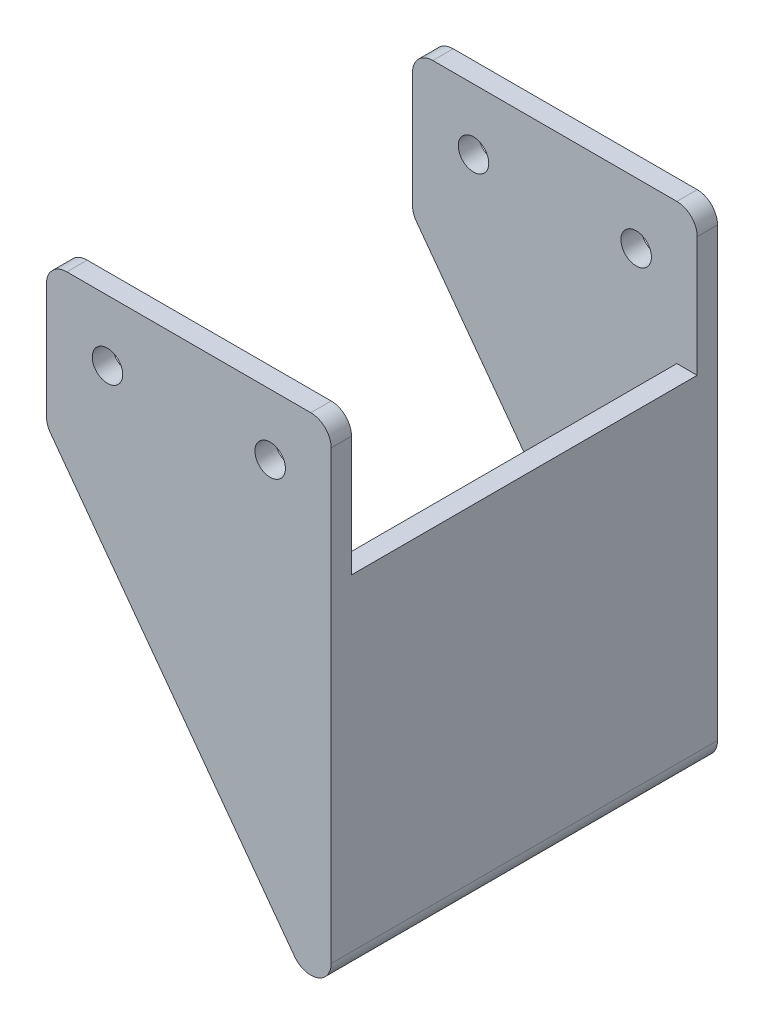
ISO-10303-21;
HEADER;
FILE_DESCRIPTION(('STEP AP214'),'2;1');
FILE_NAME('part.step','',(''),(''),'','','');
FILE_SCHEMA(('AUTOMOTIVE_DESIGN { 1 0 10303 214 1 1 1 1 }'));
ENDSEC;
DATA;
#1=APPLICATION_CONTEXT('core data for automotive mechanical design processes');
#2=APPLICATION_PROTOCOL_DEFINITION('international standard','automotive_design',2000,#1);
#3=PRODUCT_CONTEXT('',#1,'mechanical');
#4=PRODUCT('Part','Part','',(#3));
#5=PRODUCT_RELATED_PRODUCT_CATEGORY('part','',(#4));
#6=PRODUCT_DEFINITION_FORMATION('','',#4);
#7=PRODUCT_DEFINITION_CONTEXT('part definition',#1,'design');
#8=PRODUCT_DEFINITION('design','',#6,#7);
#9=PRODUCT_DEFINITION_SHAPE('','',#8);
#10=(LENGTH_UNIT() NAMED_UNIT(*) SI_UNIT(.MILLI.,.METRE.));
#11=(NAMED_UNIT(*) PLANE_ANGLE_UNIT() SI_UNIT($,.RADIAN.));
#12=(NAMED_UNIT(*) SI_UNIT($,.STERADIAN.) SOLID_ANGLE_UNIT());
#13=UNCERTAINTY_MEASURE_WITH_UNIT(LENGTH_MEASURE(1.E-05),#10,'distance_accuracy_value','');
#14=(GEOMETRIC_REPRESENTATION_CONTEXT(3) GLOBAL_UNCERTAINTY_ASSIGNED_CONTEXT((#13)) GLOBAL_UNIT_ASSIGNED_CONTEXT((#10,
#11,#12)) REPRESENTATION_CONTEXT('',''));
#15=CARTESIAN_POINT('',(0.,0.,0.));
#16=DIRECTION('',(0.,0.,1.));
#17=DIRECTION('',(1.,0.,0.));
#18=AXIS2_PLACEMENT_3D('',#15,#16,#17);
#19=CARTESIAN_POINT('',(-1.,-22.957082325542,9.5));
#20=DIRECTION('',(0.,0.,-1.));
#21=DIRECTION('',(-1.,0.,0.));
#22=AXIS2_PLACEMENT_3D('',#19,#20,#21);
#23=CYLINDRICAL_SURFACE('',#22,1.);
#24=CARTESIAN_POINT('',(-1.,-22.957082325542,-8.5));
#25=DIRECTION('',(0.,0.,1.));
#26=DIRECTION('',(1.,0.,0.));
#27=AXIS2_PLACEMENT_3D('',#24,#25,#26);
#28=CIRCLE('',#27,1.);
#29=CARTESIAN_POINT('',(-1.80505583735339,-23.5502813635918,-8.5));
#30=VERTEX_POINT('',#29);
#31=CARTESIAN_POINT('',(-1.,-23.957082325542,-8.5));
#32=VERTEX_POINT('',#31);
#33=EDGE_CURVE('E339',#30,#32,#28,.T.);
#34=ORIENTED_EDGE('',*,*,#33,.F.);
#35=DIRECTION('',(0.,0.,-1.));
#36=VECTOR('',#35,1.);
#37=CARTESIAN_POINT('',(-1.80505583735339,-23.5502813635918,9.5));
#38=LINE('',#37,#36);
#39=CARTESIAN_POINT('',(-1.80505583735339,-23.5502813635918,-9.5));
#40=VERTEX_POINT('',#39);
#41=EDGE_CURVE('E100',#30,#40,#38,.T.);
#42=ORIENTED_EDGE('',*,*,#41,.T.);
#43=CARTESIAN_POINT('',(-1.,-22.957082325542,-9.5));
#44=DIRECTION('',(0.,0.,1.));
#45=DIRECTION('',(-1.,0.,0.));
#46=AXIS2_PLACEMENT_3D('',#43,#44,#45);
#47=CIRCLE('',#46,1.);
#48=CARTESIAN_POINT('',(0.,-22.957082325542,-9.5));
#49=VERTEX_POINT('',#48);
#50=EDGE_CURVE('E162',#40,#49,#47,.T.);
#51=ORIENTED_EDGE('',*,*,#50,.T.);
#52=DIRECTION('',(0.,0.,-1.));
#53=VECTOR('',#52,1.);
#54=CARTESIAN_POINT('',(0.,-22.957082325542,9.5));
#55=LINE('',#54,#53);
#56=CARTESIAN_POINT('',(0.,-22.957082325542,9.5));
#57=VERTEX_POINT('',#56);
#58=EDGE_CURVE('E218',#57,#49,#55,.T.);
#59=ORIENTED_EDGE('',*,*,#58,.F.);
#60=CARTESIAN_POINT('',(-1.,-22.957082325542,9.5));
#61=DIRECTION('',(0.,0.,1.));
#62=DIRECTION('',(-1.,0.,0.));
#63=AXIS2_PLACEMENT_3D('',#60,#61,#62);
#64=CIRCLE('',#63,1.);
#65=CARTESIAN_POINT('',(-1.80505583735339,-23.5502813635918,9.5));
#66=VERTEX_POINT('',#65);
#67=EDGE_CURVE('E192',#66,#57,#64,.T.);
#68=ORIENTED_EDGE('',*,*,#67,.F.);
#69=CARTESIAN_POINT('',(-1.80505583735339,-23.5502813635918,8.5));
#70=VERTEX_POINT('',#69);
#71=EDGE_CURVE('E193',#66,#70,#38,.T.);
#72=ORIENTED_EDGE('',*,*,#71,.T.);
#73=CARTESIAN_POINT('',(-1.,-22.957082325542,8.5));
#74=DIRECTION('',(0.,0.,1.));
#75=DIRECTION('',(1.,0.,0.));
#76=AXIS2_PLACEMENT_3D('',#73,#74,#75);
#77=CIRCLE('',#76,1.);
#78=CARTESIAN_POINT('',(-1.,-23.957082325542,8.5));
#79=VERTEX_POINT('',#78);
#80=EDGE_CURVE('E57',#70,#79,#77,.T.);
#81=ORIENTED_EDGE('',*,*,#80,.T.);
#82=DIRECTION('',(0.,0.,-1.));
#83=VECTOR('',#82,1.);
#84=CARTESIAN_POINT('',(-1.,-23.957082325542,9.5));
#85=LINE('',#84,#83);
#86=EDGE_CURVE('E11',#79,#32,#85,.T.);
#87=ORIENTED_EDGE('',*,*,#86,.T.);
#88=EDGE_LOOP('',(#34,#42,#51,#59,#68,#72,#81,#87));
#89=FACE_BOUND('',#88,.T.);
#90=ADVANCED_FACE('F42',(#89),#23,.T.);
#91=CARTESIAN_POINT('',(0.,-1.00000000000001,9.5));
#92=DIRECTION('',(-1.,0.,0.));
#93=DIRECTION('',(0.,0.,1.));
#94=AXIS2_PLACEMENT_3D('',#91,#92,#93);
#95=PLANE('',#94);
#96=DIRECTION('',(0.,1.,0.));
#97=VECTOR('',#96,1.);
#98=CARTESIAN_POINT('',(0.,-1.00000000000001,-8.5));
#99=LINE('',#98,#97);
#100=CARTESIAN_POINT('',(0.,-6.90709701946873,-8.5));
#101=VERTEX_POINT('',#100);
#102=CARTESIAN_POINT('',(0.,-1.,-8.5));
#103=VERTEX_POINT('',#102);
#104=EDGE_CURVE('E245',#101,#103,#99,.T.);
#105=ORIENTED_EDGE('',*,*,#104,.F.);
#106=DIRECTION('',(0.,0.,1.));
#107=VECTOR('',#106,1.);
#108=CARTESIAN_POINT('',(0.,-6.90709701946873,9.5));
#109=LINE('',#108,#107);
#110=CARTESIAN_POINT('',(0.,-6.90709701946873,8.5));
#111=VERTEX_POINT('',#110);
#112=EDGE_CURVE('E50',#101,#111,#109,.T.);
#113=ORIENTED_EDGE('',*,*,#112,.T.);
#114=DIRECTION('',(0.,1.,0.));
#115=VECTOR('',#114,1.);
#116=CARTESIAN_POINT('',(0.,-1.00000000000001,8.5));
#117=LINE('',#116,#115);
#118=CARTESIAN_POINT('',(0.,-1.,8.5));
#119=VERTEX_POINT('',#118);
#120=EDGE_CURVE('E241',#111,#119,#117,.T.);
#121=ORIENTED_EDGE('',*,*,#120,.T.);
#122=DIRECTION('',(0.,0.,-1.));
#123=VECTOR('',#122,1.);
#124=CARTESIAN_POINT('',(0.,-1.00000000000001,9.5));
#125=LINE('',#124,#123);
#126=CARTESIAN_POINT('',(0.,-1.00000000000001,9.5));
#127=VERTEX_POINT('',#126);
#128=EDGE_CURVE('E214',#127,#119,#125,.T.);
#129=ORIENTED_EDGE('',*,*,#128,.F.);
#130=DIRECTION('',(0.,1.,0.));
#131=VECTOR('',#130,1.);
#132=CARTESIAN_POINT('',(0.,-1.00000000000001,9.5));
#133=LINE('',#132,#131);
#134=EDGE_CURVE('E109',#57,#127,#133,.T.);
#135=ORIENTED_EDGE('',*,*,#134,.F.);
#136=ORIENTED_EDGE('',*,*,#58,.T.);
#137=DIRECTION('',(0.,1.,0.));
#138=VECTOR('',#137,1.);
#139=CARTESIAN_POINT('',(0.,-1.00000000000001,-9.5));
#140=LINE('',#139,#138);
#141=CARTESIAN_POINT('',(0.,-1.00000000000001,-9.5));
#142=VERTEX_POINT('',#141);
#143=EDGE_CURVE('E165',#49,#142,#140,.T.);
#144=ORIENTED_EDGE('',*,*,#143,.T.);
#145=EDGE_CURVE('E213',#103,#142,#125,.T.);
#146=ORIENTED_EDGE('',*,*,#145,.F.);
#147=EDGE_LOOP('',(#105,#113,#121,#129,#135,#136,#144,#146));
#148=FACE_BOUND('',#147,.T.);
#149=ADVANCED_FACE('F238',(#148),#95,.F.);
#150=CARTESIAN_POINT('',(-1.,-1.,9.5));
#151=DIRECTION('',(0.,0.,-1.));
#152=DIRECTION('',(-1.,0.,0.));
#153=AXIS2_PLACEMENT_3D('',#150,#151,#152);
#154=CYLINDRICAL_SURFACE('',#153,1.);
#155=CARTESIAN_POINT('',(-1.,-1.,-8.5));
#156=DIRECTION('',(0.,0.,1.));
#157=DIRECTION('',(1.,0.,0.));
#158=AXIS2_PLACEMENT_3D('',#155,#156,#157);
#159=CIRCLE('',#158,1.);
#160=CARTESIAN_POINT('',(-1.00000000000001,0.,-8.5));
#161=VERTEX_POINT('',#160);
#162=EDGE_CURVE('E335',#103,#161,#159,.T.);
#163=ORIENTED_EDGE('',*,*,#162,.F.);
#164=ORIENTED_EDGE('',*,*,#145,.T.);
#165=CARTESIAN_POINT('',(-1.,-1.,-9.5));
#166=DIRECTION('',(0.,0.,1.));
#167=DIRECTION('',(1.,0.,0.));
#168=AXIS2_PLACEMENT_3D('',#165,#166,#167);
#169=CIRCLE('',#168,1.);
#170=CARTESIAN_POINT('',(-1.00000000000001,0.,-9.5));
#171=VERTEX_POINT('',#170);
#172=EDGE_CURVE('E170',#142,#171,#169,.T.);
#173=ORIENTED_EDGE('',*,*,#172,.T.);
#174=DIRECTION('',(0.,0.,-1.));
#175=VECTOR('',#174,1.);
#176=CARTESIAN_POINT('',(-1.00000000000001,0.,9.5));
#177=LINE('',#176,#175);
#178=EDGE_CURVE('E208',#161,#171,#177,.T.);
#179=ORIENTED_EDGE('',*,*,#178,.F.);
#180=EDGE_LOOP('',(#163,#164,#173,#179));
#181=FACE_BOUND('',#180,.T.);
#182=ADVANCED_FACE('F376',(#181),#154,.T.);
#183=CARTESIAN_POINT('',(-13.,0.,9.5));
#184=DIRECTION('',(0.,-1.,0.));
#185=DIRECTION('',(0.,0.,-1.));
#186=AXIS2_PLACEMENT_3D('',#183,#184,#185);
#187=PLANE('',#186);
#188=DIRECTION('',(-1.,0.,0.));
#189=VECTOR('',#188,1.);
#190=CARTESIAN_POINT('',(-13.,0.,-8.5));
#191=LINE('',#190,#189);
#192=CARTESIAN_POINT('',(-13.,0.,-8.5));
#193=VERTEX_POINT('',#192);
#194=EDGE_CURVE('E331',#161,#193,#191,.T.);
#195=ORIENTED_EDGE('',*,*,#194,.F.);
#196=ORIENTED_EDGE('',*,*,#178,.T.);
#197=DIRECTION('',(-1.,0.,0.));
#198=VECTOR('',#197,1.);
#199=CARTESIAN_POINT('',(-13.,0.,-9.5));
#200=LINE('',#199,#198);
#201=CARTESIAN_POINT('',(-13.,0.,-9.5));
#202=VERTEX_POINT('',#201);
#203=EDGE_CURVE('E173',#171,#202,#200,.T.);
#204=ORIENTED_EDGE('',*,*,#203,.T.);
#205=DIRECTION('',(0.,0.,-1.));
#206=VECTOR('',#205,1.);
#207=CARTESIAN_POINT('',(-13.,0.,9.5));
#208=LINE('',#207,#206);
#209=EDGE_CURVE('E203',#193,#202,#208,.T.);
#210=ORIENTED_EDGE('',*,*,#209,.F.);
#211=EDGE_LOOP('',(#195,#196,#204,#210));
#212=FACE_BOUND('',#211,.T.);
#213=ADVANCED_FACE('F369',(#212),#187,.F.);
#214=CARTESIAN_POINT('',(-13.,-1.,9.5));
#215=DIRECTION('',(0.,0.,-1.));
#216=DIRECTION('',(-1.,0.,0.));
#217=AXIS2_PLACEMENT_3D('',#214,#215,#216);
#218=CYLINDRICAL_SURFACE('',#217,1.);
#219=CARTESIAN_POINT('',(-13.,-1.,-8.5));
#220=DIRECTION('',(0.,0.,1.));
#221=DIRECTION('',(1.,0.,0.));
#222=AXIS2_PLACEMENT_3D('',#219,#220,#221);
#223=CIRCLE('',#222,1.);
#224=CARTESIAN_POINT('',(-14.,-1.00000000000001,-8.5));
#225=VERTEX_POINT('',#224);
#226=EDGE_CURVE('E327',#193,#225,#223,.T.);
#227=ORIENTED_EDGE('',*,*,#226,.F.);
#228=ORIENTED_EDGE('',*,*,#209,.T.);
#229=CARTESIAN_POINT('',(-13.,-1.,-9.5));
#230=DIRECTION('',(0.,0.,1.));
#231=DIRECTION('',(-1.,0.,0.));
#232=AXIS2_PLACEMENT_3D('',#229,#230,#231);
#233=CIRCLE('',#232,1.);
#234=CARTESIAN_POINT('',(-14.,-1.00000000000001,-9.5));
#235=VERTEX_POINT('',#234);
#236=EDGE_CURVE('E177',#202,#235,#233,.T.);
#237=ORIENTED_EDGE('',*,*,#236,.T.);
#238=DIRECTION('',(0.,0.,-1.));
#239=VECTOR('',#238,1.);
#240=CARTESIAN_POINT('',(-14.,-1.00000000000001,9.5));
#241=LINE('',#240,#239);
#242=EDGE_CURVE('E148',#225,#235,#241,.T.);
#243=ORIENTED_EDGE('',*,*,#242,.F.);
#244=EDGE_LOOP('',(#227,#228,#237,#243));
#245=FACE_BOUND('',#244,.T.);
#246=ADVANCED_FACE('F386',(#245),#218,.T.);
#247=CARTESIAN_POINT('',(-14.,-6.67136803982772,9.5));
#248=DIRECTION('',(1.,0.,0.));
#249=DIRECTION('',(0.,0.,-1.));
#250=AXIS2_PLACEMENT_3D('',#247,#248,#249);
#251=PLANE('',#250);
#252=DIRECTION('',(0.,-1.,0.));
#253=VECTOR('',#252,1.);
#254=CARTESIAN_POINT('',(-14.,-6.67136803982772,-8.5));
#255=LINE('',#254,#253);
#256=CARTESIAN_POINT('',(-14.,-6.67136803982772,-8.5));
#257=VERTEX_POINT('',#256);
#258=EDGE_CURVE('E323',#225,#257,#255,.T.);
#259=ORIENTED_EDGE('',*,*,#258,.F.);
#260=ORIENTED_EDGE('',*,*,#242,.T.);
#261=DIRECTION('',(0.,-1.,0.));
#262=VECTOR('',#261,1.);
#263=CARTESIAN_POINT('',(-14.,-6.67136803982772,-9.5));
#264=LINE('',#263,#262);
#265=CARTESIAN_POINT('',(-14.,-6.67136803982772,-9.5));
#266=VERTEX_POINT('',#265);
#267=EDGE_CURVE('E181',#235,#266,#264,.T.);
#268=ORIENTED_EDGE('',*,*,#267,.T.);
#269=DIRECTION('',(0.,0.,-1.));
#270=VECTOR('',#269,1.);
#271=CARTESIAN_POINT('',(-14.,-6.67136803982772,9.5));
#272=LINE('',#271,#270);
#273=EDGE_CURVE('E149',#257,#266,#272,.T.);
#274=ORIENTED_EDGE('',*,*,#273,.F.);
#275=EDGE_LOOP('',(#259,#260,#268,#274));
#276=FACE_BOUND('',#275,.T.);
#277=ADVANCED_FACE('F442',(#276),#251,.F.);
#278=CARTESIAN_POINT('',(-13.,-6.67136803982772,9.5));
#279=DIRECTION('',(0.,0.,-1.));
#280=DIRECTION('',(-1.,0.,0.));
#281=AXIS2_PLACEMENT_3D('',#278,#279,#280);
#282=CYLINDRICAL_SURFACE('',#281,0.999999999999999);
#283=CARTESIAN_POINT('',(-13.,-6.67136803982772,-8.5));
#284=DIRECTION('',(0.,0.,1.));
#285=DIRECTION('',(1.,0.,0.));
#286=AXIS2_PLACEMENT_3D('',#283,#284,#285);
#287=CIRCLE('',#286,0.999999999999999);
#288=CARTESIAN_POINT('',(-13.8050558373534,-7.26456707787758,-8.5));
#289=VERTEX_POINT('',#288);
#290=EDGE_CURVE('E319',#257,#289,#287,.T.);
#291=ORIENTED_EDGE('',*,*,#290,.F.);
#292=ORIENTED_EDGE('',*,*,#273,.T.);
#293=CARTESIAN_POINT('',(-13.,-6.67136803982772,-9.5));
#294=DIRECTION('',(0.,0.,1.));
#295=DIRECTION('',(-1.,0.,0.));
#296=AXIS2_PLACEMENT_3D('',#293,#294,#295);
#297=CIRCLE('',#296,0.999999999999999);
#298=CARTESIAN_POINT('',(-13.8050558373534,-7.26456707787758,-9.5));
#299=VERTEX_POINT('',#298);
#300=EDGE_CURVE('E185',#266,#299,#297,.T.);
#301=ORIENTED_EDGE('',*,*,#300,.T.);
#302=DIRECTION('',(0.,0.,-1.));
#303=VECTOR('',#302,1.);
#304=CARTESIAN_POINT('',(-13.8050558373534,-7.26456707787758,9.5));
#305=LINE('',#304,#303);
#306=EDGE_CURVE('E197',#289,#299,#305,.T.);
#307=ORIENTED_EDGE('',*,*,#306,.F.);
#308=EDGE_LOOP('',(#291,#292,#301,#307));
#309=FACE_BOUND('',#308,.T.);
#310=ADVANCED_FACE('F437',(#309),#282,.T.);
#311=CARTESIAN_POINT('',(-1.80505583735339,-23.5502813635918,9.5));
#312=DIRECTION('',(0.805055837353368,0.59319903804985,0.));
#313=DIRECTION('',(-0.59319903804985,0.805055837353368,0.));
#314=AXIS2_PLACEMENT_3D('',#311,#312,#313);
#315=PLANE('',#314);
#316=DIRECTION('',(0.59319903804985,-0.805055837353368,0.));
#317=VECTOR('',#316,1.);
#318=CARTESIAN_POINT('',(-1.80505583735339,-23.5502813635918,-8.5));
#319=LINE('',#318,#317);
#320=EDGE_CURVE('E315',#289,#30,#319,.T.);
#321=ORIENTED_EDGE('',*,*,#320,.F.);
#322=ORIENTED_EDGE('',*,*,#306,.T.);
#323=DIRECTION('',(0.59319903804985,-0.805055837353368,0.));
#324=VECTOR('',#323,1.);
#325=CARTESIAN_POINT('',(-1.80505583735339,-23.5502813635918,-9.5));
#326=LINE('',#325,#324);
#327=EDGE_CURVE('E189',#299,#40,#326,.T.);
#328=ORIENTED_EDGE('',*,*,#327,.T.);
#329=ORIENTED_EDGE('',*,*,#41,.F.);
#330=EDGE_LOOP('',(#321,#322,#328,#329));
#331=FACE_BOUND('',#330,.T.);
#332=ADVANCED_FACE('F433',(#331),#315,.F.);
#333=CARTESIAN_POINT('',(-11.,-3.,9.5));
#334=DIRECTION('',(0.,0.,-1.));
#335=DIRECTION('',(-1.,0.,0.));
#336=AXIS2_PLACEMENT_3D('',#333,#334,#335);
#337=CYLINDRICAL_SURFACE('',#336,0.75);
#338=CARTESIAN_POINT('',(-11.,-3.,-9.5));
#339=DIRECTION('',(0.,0.,1.));
#340=DIRECTION('',(1.,0.,0.));
#341=AXIS2_PLACEMENT_3D('',#338,#339,#340);
#342=CIRCLE('',#341,0.75);
#343=CARTESIAN_POINT('',(-10.25,-3.,-9.5));
#344=VERTEX_POINT('',#343);
#345=EDGE_CURVE('E347',#344,#344,#342,.T.);
#346=ORIENTED_EDGE('',*,*,#345,.F.);
#347=EDGE_LOOP('',(#346));
#348=FACE_BOUND('',#347,.T.);
#349=CARTESIAN_POINT('',(-11.,-3.,-8.5));
#350=DIRECTION('',(0.,0.,1.));
#351=DIRECTION('',(1.,0.,0.));
#352=AXIS2_PLACEMENT_3D('',#349,#350,#351);
#353=CIRCLE('',#352,0.75);
#354=CARTESIAN_POINT('',(-10.25,-3.,-8.5));
#355=VERTEX_POINT('',#354);
#356=EDGE_CURVE('E230',#355,#355,#353,.T.);
#357=ORIENTED_EDGE('',*,*,#356,.T.);
#358=EDGE_LOOP('',(#357));
#359=FACE_BOUND('',#358,.T.);
#360=ADVANCED_FACE('F489',(#348,#359),#337,.F.);
#361=CARTESIAN_POINT('',(-3.,-3.,9.5));
#362=DIRECTION('',(0.,0.,-1.));
#363=DIRECTION('',(-1.,0.,0.));
#364=AXIS2_PLACEMENT_3D('',#361,#362,#363);
#365=CYLINDRICAL_SURFACE('',#364,0.75);
#366=CARTESIAN_POINT('',(-3.,-3.,-9.5));
#367=DIRECTION('',(0.,0.,1.));
#368=DIRECTION('',(1.,0.,0.));
#369=AXIS2_PLACEMENT_3D('',#366,#367,#368);
#370=CIRCLE('',#369,0.75);
#371=CARTESIAN_POINT('',(-2.25,-3.,-9.5));
#372=VERTEX_POINT('',#371);
#373=EDGE_CURVE('E342',#372,#372,#370,.T.);
#374=ORIENTED_EDGE('',*,*,#373,.F.);
#375=EDGE_LOOP('',(#374));
#376=FACE_BOUND('',#375,.T.);
#377=CARTESIAN_POINT('',(-3.,-3.,-8.5));
#378=DIRECTION('',(0.,0.,1.));
#379=DIRECTION('',(1.,0.,0.));
#380=AXIS2_PLACEMENT_3D('',#377,#378,#379);
#381=CIRCLE('',#380,0.75);
#382=CARTESIAN_POINT('',(-2.25,-3.,-8.5));
#383=VERTEX_POINT('',#382);
#384=EDGE_CURVE('E227',#383,#383,#381,.T.);
#385=ORIENTED_EDGE('',*,*,#384,.T.);
#386=EDGE_LOOP('',(#385));
#387=FACE_BOUND('',#386,.T.);
#388=ADVANCED_FACE('F474',(#376,#387),#365,.F.);
#389=CARTESIAN_POINT('',(-1.,-22.957082325542,9.5));
#390=DIRECTION('',(0.,0.,-1.));
#391=DIRECTION('',(-1.,0.,0.));
#392=AXIS2_PLACEMENT_3D('',#389,#390,#391);
#393=PLANE('',#392);
#394=ORIENTED_EDGE('',*,*,#67,.T.);
#395=ORIENTED_EDGE('',*,*,#134,.T.);
#396=CARTESIAN_POINT('',(-1.,-1.,9.5));
#397=DIRECTION('',(0.,0.,1.));
#398=DIRECTION('',(1.,0.,0.));
#399=AXIS2_PLACEMENT_3D('',#396,#397,#398);
#400=CIRCLE('',#399,1.);
#401=CARTESIAN_POINT('',(-1.00000000000001,0.,9.5));
#402=VERTEX_POINT('',#401);
#403=EDGE_CURVE('E359',#127,#402,#400,.T.);
#404=ORIENTED_EDGE('',*,*,#403,.T.);
#405=DIRECTION('',(-1.,0.,0.));
#406=VECTOR('',#405,1.);
#407=CARTESIAN_POINT('',(-13.,0.,9.5));
#408=LINE('',#407,#406);
#409=CARTESIAN_POINT('',(-13.,0.,9.5));
#410=VERTEX_POINT('',#409);
#411=EDGE_CURVE('E362',#402,#410,#408,.T.);
#412=ORIENTED_EDGE('',*,*,#411,.T.);
#413=CARTESIAN_POINT('',(-13.,-1.,9.5));
#414=DIRECTION('',(0.,0.,1.));
#415=DIRECTION('',(-1.,0.,0.));
#416=AXIS2_PLACEMENT_3D('',#413,#414,#415);
#417=CIRCLE('',#416,1.);
#418=CARTESIAN_POINT('',(-14.,-1.00000000000001,9.5));
#419=VERTEX_POINT('',#418);
#420=EDGE_CURVE('E132',#410,#419,#417,.T.);
#421=ORIENTED_EDGE('',*,*,#420,.T.);
#422=DIRECTION('',(0.,-1.,0.));
#423=VECTOR('',#422,1.);
#424=CARTESIAN_POINT('',(-14.,-6.67136803982772,9.5));
#425=LINE('',#424,#423);
#426=CARTESIAN_POINT('',(-14.,-6.67136803982772,9.5));
#427=VERTEX_POINT('',#426);
#428=EDGE_CURVE('E124',#419,#427,#425,.T.);
#429=ORIENTED_EDGE('',*,*,#428,.T.);
#430=CARTESIAN_POINT('',(-13.,-6.67136803982772,9.5));
#431=DIRECTION('',(0.,0.,1.));
#432=DIRECTION('',(-1.,0.,0.));
#433=AXIS2_PLACEMENT_3D('',#430,#431,#432);
#434=CIRCLE('',#433,0.999999999999999);
#435=CARTESIAN_POINT('',(-13.8050558373534,-7.26456707787758,9.5));
#436=VERTEX_POINT('',#435);
#437=EDGE_CURVE('E129',#427,#436,#434,.T.);
#438=ORIENTED_EDGE('',*,*,#437,.T.);
#439=DIRECTION('',(0.59319903804985,-0.805055837353368,0.));
#440=VECTOR('',#439,1.);
#441=CARTESIAN_POINT('',(-1.80505583735339,-23.5502813635918,9.5));
#442=LINE('',#441,#440);
#443=EDGE_CURVE('E66',#436,#66,#442,.T.);
#444=ORIENTED_EDGE('',*,*,#443,.T.);
#445=EDGE_LOOP('',(#394,#395,#404,#412,#421,#429,#438,#444));
#446=FACE_BOUND('',#445,.T.);
#447=CARTESIAN_POINT('',(-11.,-3.,9.5));
#448=DIRECTION('',(0.,0.,1.));
#449=DIRECTION('',(1.,0.,0.));
#450=AXIS2_PLACEMENT_3D('',#447,#448,#449);
#451=CIRCLE('',#450,0.75);
#452=CARTESIAN_POINT('',(-10.25,-3.,9.5));
#453=VERTEX_POINT('',#452);
#454=EDGE_CURVE('E166',#453,#453,#451,.T.);
#455=ORIENTED_EDGE('',*,*,#454,.F.);
#456=EDGE_LOOP('',(#455));
#457=FACE_BOUND('',#456,.T.);
#458=CARTESIAN_POINT('',(-3.,-3.,9.5));
#459=DIRECTION('',(0.,0.,1.));
#460=DIRECTION('',(1.,0.,0.));
#461=AXIS2_PLACEMENT_3D('',#458,#459,#460);
#462=CIRCLE('',#461,0.75);
#463=CARTESIAN_POINT('',(-2.25,-3.,9.5));
#464=VERTEX_POINT('',#463);
#465=EDGE_CURVE('E343',#464,#464,#462,.T.);
#466=ORIENTED_EDGE('',*,*,#465,.F.);
#467=EDGE_LOOP('',(#466));
#468=FACE_BOUND('',#467,.T.);
#469=ADVANCED_FACE('F126',(#446,#457,#468),#393,.F.);
#470=CARTESIAN_POINT('',(-1.,-22.957082325542,-9.5));
#471=DIRECTION('',(0.,0.,-1.));
#472=DIRECTION('',(-1.,0.,0.));
#473=AXIS2_PLACEMENT_3D('',#470,#471,#472);
#474=PLANE('',#473);
#475=ORIENTED_EDGE('',*,*,#345,.T.);
#476=EDGE_LOOP('',(#475));
#477=FACE_BOUND('',#476,.T.);
#478=ORIENTED_EDGE('',*,*,#50,.F.);
#479=ORIENTED_EDGE('',*,*,#327,.F.);
#480=ORIENTED_EDGE('',*,*,#300,.F.);
#481=ORIENTED_EDGE('',*,*,#267,.F.);
#482=ORIENTED_EDGE('',*,*,#236,.F.);
#483=ORIENTED_EDGE('',*,*,#203,.F.);
#484=ORIENTED_EDGE('',*,*,#172,.F.);
#485=ORIENTED_EDGE('',*,*,#143,.F.);
#486=EDGE_LOOP('',(#478,#479,#480,#481,#482,#483,#484,#485));
#487=FACE_BOUND('',#486,.T.);
#488=ORIENTED_EDGE('',*,*,#373,.T.);
#489=EDGE_LOOP('',(#488));
#490=FACE_BOUND('',#489,.T.);
#491=ADVANCED_FACE('F379',(#477,#487,#490),#474,.T.);
#492=ORIENTED_EDGE('',*,*,#128,.T.);
#493=CARTESIAN_POINT('',(-1.,-1.,8.5));
#494=DIRECTION('',(0.,0.,1.));
#495=DIRECTION('',(1.,0.,0.));
#496=AXIS2_PLACEMENT_3D('',#493,#494,#495);
#497=CIRCLE('',#496,1.);
#498=CARTESIAN_POINT('',(-1.00000000000001,0.,8.5));
#499=VERTEX_POINT('',#498);
#500=EDGE_CURVE('E304',#119,#499,#497,.T.);
#501=ORIENTED_EDGE('',*,*,#500,.T.);
#502=EDGE_CURVE('E209',#402,#499,#177,.T.);
#503=ORIENTED_EDGE('',*,*,#502,.F.);
#504=ORIENTED_EDGE('',*,*,#403,.F.);
#505=EDGE_LOOP('',(#492,#501,#503,#504));
#506=FACE_BOUND('',#505,.T.);
#507=ADVANCED_FACE('F422',(#506),#154,.T.);
#508=ORIENTED_EDGE('',*,*,#502,.T.);
#509=DIRECTION('',(-1.,0.,0.));
#510=VECTOR('',#509,1.);
#511=CARTESIAN_POINT('',(-13.,0.,8.5));
#512=LINE('',#511,#510);
#513=CARTESIAN_POINT('',(-13.,0.,8.5));
#514=VERTEX_POINT('',#513);
#515=EDGE_CURVE('E300',#499,#514,#512,.T.);
#516=ORIENTED_EDGE('',*,*,#515,.T.);
#517=EDGE_CURVE('E204',#410,#514,#208,.T.);
#518=ORIENTED_EDGE('',*,*,#517,.F.);
#519=ORIENTED_EDGE('',*,*,#411,.F.);
#520=EDGE_LOOP('',(#508,#516,#518,#519));
#521=FACE_BOUND('',#520,.T.);
#522=ADVANCED_FACE('F426',(#521),#187,.F.);
#523=ORIENTED_EDGE('',*,*,#517,.T.);
#524=CARTESIAN_POINT('',(-13.,-1.,8.5));
#525=DIRECTION('',(0.,0.,1.));
#526=DIRECTION('',(1.,0.,0.));
#527=AXIS2_PLACEMENT_3D('',#524,#525,#526);
#528=CIRCLE('',#527,1.);
#529=CARTESIAN_POINT('',(-14.,-1.00000000000001,8.5));
#530=VERTEX_POINT('',#529);
#531=EDGE_CURVE('E296',#514,#530,#528,.T.);
#532=ORIENTED_EDGE('',*,*,#531,.T.);
#533=EDGE_CURVE('E200',#419,#530,#241,.T.);
#534=ORIENTED_EDGE('',*,*,#533,.F.);
#535=ORIENTED_EDGE('',*,*,#420,.F.);
#536=EDGE_LOOP('',(#523,#532,#534,#535));
#537=FACE_BOUND('',#536,.T.);
#538=ADVANCED_FACE('F447',(#537),#218,.T.);
#539=ORIENTED_EDGE('',*,*,#533,.T.);
#540=DIRECTION('',(0.,-1.,0.));
#541=VECTOR('',#540,1.);
#542=CARTESIAN_POINT('',(-14.,-6.67136803982772,8.5));
#543=LINE('',#542,#541);
#544=CARTESIAN_POINT('',(-14.,-6.67136803982772,8.5));
#545=VERTEX_POINT('',#544);
#546=EDGE_CURVE('E144',#530,#545,#543,.T.);
#547=ORIENTED_EDGE('',*,*,#546,.T.);
#548=EDGE_CURVE('E140',#427,#545,#272,.T.);
#549=ORIENTED_EDGE('',*,*,#548,.F.);
#550=ORIENTED_EDGE('',*,*,#428,.F.);
#551=EDGE_LOOP('',(#539,#547,#549,#550));
#552=FACE_BOUND('',#551,.T.);
#553=ADVANCED_FACE('F141',(#552),#251,.F.);
#554=ORIENTED_EDGE('',*,*,#548,.T.);
#555=CARTESIAN_POINT('',(-13.,-6.67136803982772,8.5));
#556=DIRECTION('',(0.,0.,1.));
#557=DIRECTION('',(1.,0.,0.));
#558=AXIS2_PLACEMENT_3D('',#555,#556,#557);
#559=CIRCLE('',#558,0.999999999999999);
#560=CARTESIAN_POINT('',(-13.8050558373534,-7.26456707787758,8.5));
#561=VERTEX_POINT('',#560);
#562=EDGE_CURVE('E291',#545,#561,#559,.T.);
#563=ORIENTED_EDGE('',*,*,#562,.T.);
#564=EDGE_CURVE('E153',#436,#561,#305,.T.);
#565=ORIENTED_EDGE('',*,*,#564,.F.);
#566=ORIENTED_EDGE('',*,*,#437,.F.);
#567=EDGE_LOOP('',(#554,#563,#565,#566));
#568=FACE_BOUND('',#567,.T.);
#569=ADVANCED_FACE('F151',(#568),#282,.T.);
#570=ORIENTED_EDGE('',*,*,#564,.T.);
#571=DIRECTION('',(0.59319903804985,-0.805055837353368,0.));
#572=VECTOR('',#571,1.);
#573=CARTESIAN_POINT('',(-1.80505583735339,-23.5502813635918,8.5));
#574=LINE('',#573,#572);
#575=EDGE_CURVE('E288',#561,#70,#574,.T.);
#576=ORIENTED_EDGE('',*,*,#575,.T.);
#577=ORIENTED_EDGE('',*,*,#71,.F.);
#578=ORIENTED_EDGE('',*,*,#443,.F.);
#579=EDGE_LOOP('',(#570,#576,#577,#578));
#580=FACE_BOUND('',#579,.T.);
#581=ADVANCED_FACE('F445',(#580),#315,.F.);
#582=CARTESIAN_POINT('',(-11.,-3.,8.5));
#583=DIRECTION('',(0.,0.,1.));
#584=DIRECTION('',(1.,0.,0.));
#585=AXIS2_PLACEMENT_3D('',#582,#583,#584);
#586=CIRCLE('',#585,0.75);
#587=CARTESIAN_POINT('',(-10.25,-3.,8.5));
#588=VERTEX_POINT('',#587);
#589=EDGE_CURVE('E225',#588,#588,#586,.T.);
#590=ORIENTED_EDGE('',*,*,#589,.F.);
#591=EDGE_LOOP('',(#590));
#592=FACE_BOUND('',#591,.T.);
#593=ORIENTED_EDGE('',*,*,#454,.T.);
#594=EDGE_LOOP('',(#593));
#595=FACE_BOUND('',#594,.T.);
#596=ADVANCED_FACE('F480',(#592,#595),#337,.F.);
#597=CARTESIAN_POINT('',(-3.,-3.,8.5));
#598=DIRECTION('',(0.,0.,1.));
#599=DIRECTION('',(1.,0.,0.));
#600=AXIS2_PLACEMENT_3D('',#597,#598,#599);
#601=CIRCLE('',#600,0.75);
#602=CARTESIAN_POINT('',(-2.25,-3.,8.5));
#603=VERTEX_POINT('',#602);
#604=EDGE_CURVE('E221',#603,#603,#601,.T.);
#605=ORIENTED_EDGE('',*,*,#604,.F.);
#606=EDGE_LOOP('',(#605));
#607=FACE_BOUND('',#606,.T.);
#608=ORIENTED_EDGE('',*,*,#465,.T.);
#609=EDGE_LOOP('',(#608));
#610=FACE_BOUND('',#609,.T.);
#611=ADVANCED_FACE('F533',(#607,#610),#365,.F.);
#612=CARTESIAN_POINT('',(-1.,-28.3485790476334,-8.5));
#613=DIRECTION('',(1.,0.,0.));
#614=DIRECTION('',(0.,1.,0.));
#615=AXIS2_PLACEMENT_3D('',#612,#613,#614);
#616=PLANE('',#615);
#617=DIRECTION('',(0.,1.,0.));
#618=VECTOR('',#617,1.);
#619=CARTESIAN_POINT('',(-1.,-28.3485790476334,8.5));
#620=LINE('',#619,#618);
#621=CARTESIAN_POINT('',(-1.,-6.90709701946873,8.5));
#622=VERTEX_POINT('',#621);
#623=EDGE_CURVE('E279',#79,#622,#620,.T.);
#624=ORIENTED_EDGE('',*,*,#623,.T.);
#625=DIRECTION('',(0.,0.,1.));
#626=VECTOR('',#625,1.);
#627=CARTESIAN_POINT('',(-1.,-6.90709701946873,-8.5));
#628=LINE('',#627,#626);
#629=CARTESIAN_POINT('',(-1.,-6.90709701946873,-8.5));
#630=VERTEX_POINT('',#629);
#631=EDGE_CURVE('E226',#630,#622,#628,.T.);
#632=ORIENTED_EDGE('',*,*,#631,.F.);
#633=DIRECTION('',(0.,1.,0.));
#634=VECTOR('',#633,1.);
#635=CARTESIAN_POINT('',(-1.,-28.3485790476334,-8.5));
#636=LINE('',#635,#634);
#637=EDGE_CURVE('E268',#32,#630,#636,.T.);
#638=ORIENTED_EDGE('',*,*,#637,.F.);
#639=ORIENTED_EDGE('',*,*,#86,.F.);
#640=EDGE_LOOP('',(#624,#632,#638,#639));
#641=FACE_BOUND('',#640,.T.);
#642=ADVANCED_FACE('F418',(#641),#616,.F.);
#643=CARTESIAN_POINT('',(-1.,-6.90709701946873,-8.5));
#644=DIRECTION('',(0.,-1.,0.));
#645=DIRECTION('',(0.,0.,-1.));
#646=AXIS2_PLACEMENT_3D('',#643,#644,#645);
#647=PLANE('',#646);
#648=DIRECTION('',(1.,0.,0.));
#649=VECTOR('',#648,1.);
#650=CARTESIAN_POINT('',(-1.,-6.90709701946873,-8.5));
#651=LINE('',#650,#649);
#652=EDGE_CURVE('E256',#630,#101,#651,.T.);
#653=ORIENTED_EDGE('',*,*,#652,.F.);
#654=ORIENTED_EDGE('',*,*,#631,.T.);
#655=DIRECTION('',(1.,0.,0.));
#656=VECTOR('',#655,1.);
#657=CARTESIAN_POINT('',(-1.,-6.90709701946873,8.5));
#658=LINE('',#657,#656);
#659=EDGE_CURVE('E258',#622,#111,#658,.T.);
#660=ORIENTED_EDGE('',*,*,#659,.T.);
#661=ORIENTED_EDGE('',*,*,#112,.F.);
#662=EDGE_LOOP('',(#653,#654,#660,#661));
#663=FACE_BOUND('',#662,.T.);
#664=ADVANCED_FACE('F253',(#663),#647,.F.);
#665=CARTESIAN_POINT('',(0.,0.,-8.5));
#666=DIRECTION('',(0.,0.,1.));
#667=DIRECTION('',(1.,0.,0.));
#668=AXIS2_PLACEMENT_3D('',#665,#666,#667);
#669=PLANE('',#668);
#670=ORIENTED_EDGE('',*,*,#384,.F.);
#671=EDGE_LOOP('',(#670));
#672=FACE_BOUND('',#671,.T.);
#673=ORIENTED_EDGE('',*,*,#356,.F.);
#674=EDGE_LOOP('',(#673));
#675=FACE_BOUND('',#674,.T.);
#676=ORIENTED_EDGE('',*,*,#33,.T.);
#677=ORIENTED_EDGE('',*,*,#637,.T.);
#678=ORIENTED_EDGE('',*,*,#652,.T.);
#679=ORIENTED_EDGE('',*,*,#104,.T.);
#680=ORIENTED_EDGE('',*,*,#162,.T.);
#681=ORIENTED_EDGE('',*,*,#194,.T.);
#682=ORIENTED_EDGE('',*,*,#226,.T.);
#683=ORIENTED_EDGE('',*,*,#258,.T.);
#684=ORIENTED_EDGE('',*,*,#290,.T.);
#685=ORIENTED_EDGE('',*,*,#320,.T.);
#686=EDGE_LOOP('',(#676,#677,#678,#679,#680,#681,#682,#683,#684,#685));
#687=FACE_BOUND('',#686,.T.);
#688=ADVANCED_FACE('F264',(#672,#675,#687),#669,.T.);
#689=CARTESIAN_POINT('',(0.,0.,8.5));
#690=DIRECTION('',(0.,0.,1.));
#691=DIRECTION('',(1.,0.,0.));
#692=AXIS2_PLACEMENT_3D('',#689,#690,#691);
#693=PLANE('',#692);
#694=ORIENTED_EDGE('',*,*,#589,.T.);
#695=EDGE_LOOP('',(#694));
#696=FACE_BOUND('',#695,.T.);
#697=ORIENTED_EDGE('',*,*,#604,.T.);
#698=EDGE_LOOP('',(#697));
#699=FACE_BOUND('',#698,.T.);
#700=ORIENTED_EDGE('',*,*,#575,.F.);
#701=ORIENTED_EDGE('',*,*,#562,.F.);
#702=ORIENTED_EDGE('',*,*,#546,.F.);
#703=ORIENTED_EDGE('',*,*,#531,.F.);
#704=ORIENTED_EDGE('',*,*,#515,.F.);
#705=ORIENTED_EDGE('',*,*,#500,.F.);
#706=ORIENTED_EDGE('',*,*,#120,.F.);
#707=ORIENTED_EDGE('',*,*,#659,.F.);
#708=ORIENTED_EDGE('',*,*,#623,.F.);
#709=ORIENTED_EDGE('',*,*,#80,.F.);
#710=EDGE_LOOP('',(#700,#701,#702,#703,#704,#705,#706,#707,#708,#709));
#711=FACE_BOUND('',#710,.T.);
#712=ADVANCED_FACE('F419',(#696,#699,#711),#693,.F.);
#713=CLOSED_SHELL('',(#90,#149,#182,#213,#246,#277,#310,#332,#360,#388,#469,#491,#507,#522,#538,
#553,#569,#581,#596,#611,#642,#664,#688,#712));
#714=MANIFOLD_SOLID_BREP('B2',#713);
#715=ADVANCED_BREP_SHAPE_REPRESENTATION('',(#18,#714),#14);
#716=SHAPE_DEFINITION_REPRESENTATION(#9,#715);
ENDSEC;
END-ISO-10303-21;
